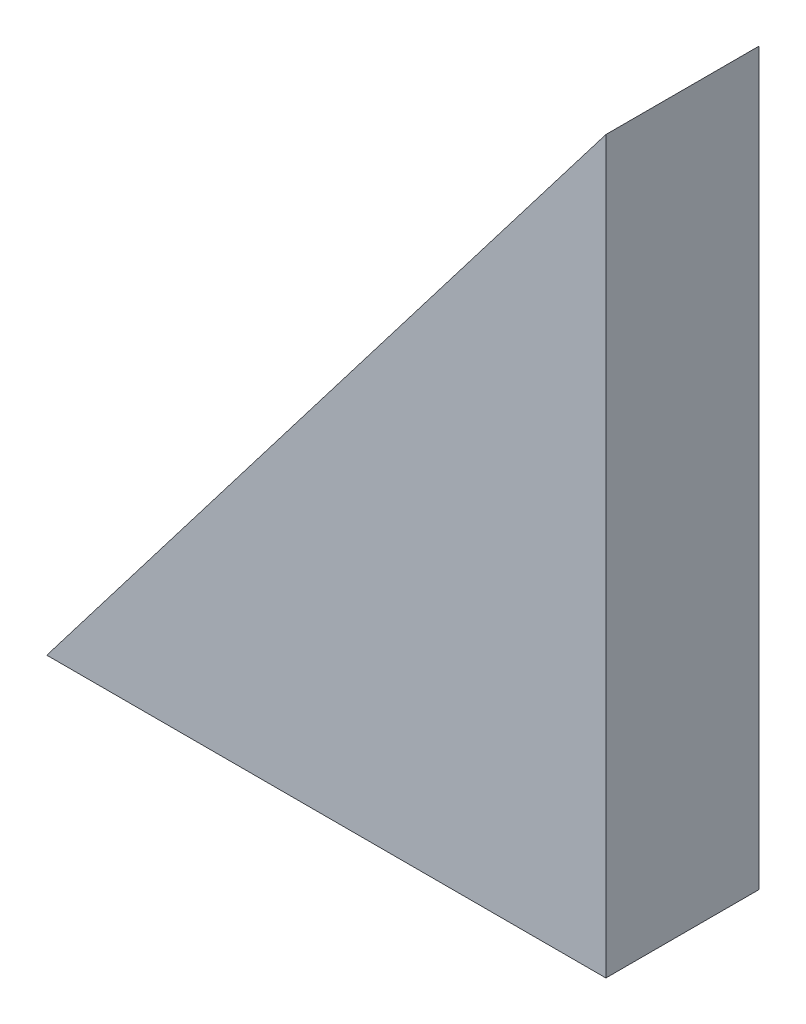
ISO-10303-21;
HEADER;
FILE_DESCRIPTION(('STEP AP214'),'2;1');
FILE_NAME('part.step','',(''),(''),'','','');
FILE_SCHEMA(('AUTOMOTIVE_DESIGN { 1 0 10303 214 1 1 1 1 }'));
ENDSEC;
DATA;
#1=APPLICATION_CONTEXT('core data for automotive mechanical design processes');
#2=APPLICATION_PROTOCOL_DEFINITION('international standard','automotive_design',2000,#1);
#3=PRODUCT_CONTEXT('',#1,'mechanical');
#4=PRODUCT('Part','Part','',(#3));
#5=PRODUCT_RELATED_PRODUCT_CATEGORY('part','',(#4));
#6=PRODUCT_DEFINITION_FORMATION('','',#4);
#7=PRODUCT_DEFINITION_CONTEXT('part definition',#1,'design');
#8=PRODUCT_DEFINITION('design','',#6,#7);
#9=PRODUCT_DEFINITION_SHAPE('','',#8);
#10=(LENGTH_UNIT() NAMED_UNIT(*) SI_UNIT(.MILLI.,.METRE.));
#11=(NAMED_UNIT(*) PLANE_ANGLE_UNIT() SI_UNIT($,.RADIAN.));
#12=(NAMED_UNIT(*) SI_UNIT($,.STERADIAN.) SOLID_ANGLE_UNIT());
#13=UNCERTAINTY_MEASURE_WITH_UNIT(LENGTH_MEASURE(1.E-05),#10,'distance_accuracy_value','');
#14=(GEOMETRIC_REPRESENTATION_CONTEXT(3) GLOBAL_UNCERTAINTY_ASSIGNED_CONTEXT((#13)) GLOBAL_UNIT_ASSIGNED_CONTEXT((#10,
#11,#12)) REPRESENTATION_CONTEXT('',''));
#15=CARTESIAN_POINT('',(0.,0.,0.));
#16=DIRECTION('',(0.,0.,1.));
#17=DIRECTION('',(1.,0.,0.));
#18=AXIS2_PLACEMENT_3D('',#15,#16,#17);
#19=CARTESIAN_POINT('',(-46.4148094009228,60.5101525690421,12.7));
#20=DIRECTION('',(0.794096490407238,-0.607791710969233,0.));
#21=DIRECTION('',(0.607791710969233,0.794096490407238,0.));
#22=AXIS2_PLACEMENT_3D('',#19,#20,#21);
#23=PLANE('',#22);
#24=DIRECTION('',(-0.607791710969233,-0.794096490407238,0.));
#25=VECTOR('',#24,1.);
#26=CARTESIAN_POINT('',(-46.4148094009228,60.5101525690421,0.));
#27=LINE('',#26,#25);
#28=CARTESIAN_POINT('',(-0.101081025067281,121.020305138074,0.));
#29=VERTEX_POINT('',#28);
#30=CARTESIAN_POINT('',(-46.4148094009228,60.5101525690421,0.));
#31=VERTEX_POINT('',#30);
#32=EDGE_CURVE('E78',#29,#31,#27,.T.);
#33=ORIENTED_EDGE('',*,*,#32,.T.);
#34=DIRECTION('',(0.,0.,-1.));
#35=VECTOR('',#34,1.);
#36=CARTESIAN_POINT('',(-46.4148094009228,60.5101525690421,12.7));
#37=LINE('',#36,#35);
#38=CARTESIAN_POINT('',(-46.4148094009228,60.5101525690421,12.7));
#39=VERTEX_POINT('',#38);
#40=EDGE_CURVE('E11',#39,#31,#37,.T.);
#41=ORIENTED_EDGE('',*,*,#40,.F.);
#42=DIRECTION('',(-0.607791710969233,-0.794096490407238,0.));
#43=VECTOR('',#42,1.);
#44=CARTESIAN_POINT('',(-46.4148094009228,60.5101525690421,12.7));
#45=LINE('',#44,#43);
#46=CARTESIAN_POINT('',(-0.101081025067281,121.020305138074,12.7));
#47=VERTEX_POINT('',#46);
#48=EDGE_CURVE('E71',#47,#39,#45,.T.);
#49=ORIENTED_EDGE('',*,*,#48,.F.);
#50=DIRECTION('',(0.,0.,-1.));
#51=VECTOR('',#50,1.);
#52=CARTESIAN_POINT('',(-0.101081025067281,121.020305138074,12.7));
#53=LINE('',#52,#51);
#54=EDGE_CURVE('E79',#47,#29,#53,.T.);
#55=ORIENTED_EDGE('',*,*,#54,.T.);
#56=EDGE_LOOP('',(#33,#41,#49,#55));
#57=FACE_BOUND('',#56,.T.);
#58=ADVANCED_FACE('F31',(#57),#23,.F.);
#59=CARTESIAN_POINT('',(-0.101081025066035,60.5101525690396,12.7));
#60=DIRECTION('',(0.,1.,0.));
#61=DIRECTION('',(-1.,0.,0.));
#62=AXIS2_PLACEMENT_3D('',#59,#60,#61);
#63=PLANE('',#62);
#64=DIRECTION('',(1.,0.,0.));
#65=VECTOR('',#64,1.);
#66=CARTESIAN_POINT('',(-0.101081025066035,60.5101525690396,0.));
#67=LINE('',#66,#65);
#68=CARTESIAN_POINT('',(-0.101081025066035,60.5101525690396,0.));
#69=VERTEX_POINT('',#68);
#70=EDGE_CURVE('E59',#31,#69,#67,.T.);
#71=ORIENTED_EDGE('',*,*,#70,.T.);
#72=DIRECTION('',(0.,0.,-1.));
#73=VECTOR('',#72,1.);
#74=CARTESIAN_POINT('',(-0.101081025066035,60.5101525690396,12.7));
#75=LINE('',#74,#73);
#76=CARTESIAN_POINT('',(-0.101081025066035,60.5101525690396,12.7));
#77=VERTEX_POINT('',#76);
#78=EDGE_CURVE('E39',#77,#69,#75,.T.);
#79=ORIENTED_EDGE('',*,*,#78,.F.);
#80=DIRECTION('',(1.,0.,0.));
#81=VECTOR('',#80,1.);
#82=CARTESIAN_POINT('',(-0.101081025066035,60.5101525690396,12.7));
#83=LINE('',#82,#81);
#84=EDGE_CURVE('E67',#39,#77,#83,.T.);
#85=ORIENTED_EDGE('',*,*,#84,.F.);
#86=ORIENTED_EDGE('',*,*,#40,.T.);
#87=EDGE_LOOP('',(#71,#79,#85,#86));
#88=FACE_BOUND('',#87,.T.);
#89=ADVANCED_FACE('F68',(#88),#63,.F.);
#90=CARTESIAN_POINT('',(-0.101081025067281,121.020305138074,12.7));
#91=DIRECTION('',(-1.,0.,0.));
#92=DIRECTION('',(0.,-1.,0.));
#93=AXIS2_PLACEMENT_3D('',#90,#91,#92);
#94=PLANE('',#93);
#95=DIRECTION('',(0.,1.,0.));
#96=VECTOR('',#95,1.);
#97=CARTESIAN_POINT('',(-0.101081025067281,121.020305138074,0.));
#98=LINE('',#97,#96);
#99=EDGE_CURVE('E64',#69,#29,#98,.T.);
#100=ORIENTED_EDGE('',*,*,#99,.T.);
#101=ORIENTED_EDGE('',*,*,#54,.F.);
#102=DIRECTION('',(0.,1.,0.));
#103=VECTOR('',#102,1.);
#104=CARTESIAN_POINT('',(-0.101081025067281,121.020305138074,12.7));
#105=LINE('',#104,#103);
#106=EDGE_CURVE('E47',#77,#47,#105,.T.);
#107=ORIENTED_EDGE('',*,*,#106,.F.);
#108=ORIENTED_EDGE('',*,*,#78,.T.);
#109=EDGE_LOOP('',(#100,#101,#107,#108));
#110=FACE_BOUND('',#109,.T.);
#111=ADVANCED_FACE('F86',(#110),#94,.F.);
#112=CARTESIAN_POINT('',(-46.4148094009228,60.5101525690421,12.7));
#113=DIRECTION('',(0.,0.,1.));
#114=DIRECTION('',(1.,0.,0.));
#115=AXIS2_PLACEMENT_3D('',#112,#113,#114);
#116=PLANE('',#115);
#117=ORIENTED_EDGE('',*,*,#48,.T.);
#118=ORIENTED_EDGE('',*,*,#84,.T.);
#119=ORIENTED_EDGE('',*,*,#106,.T.);
#120=EDGE_LOOP('',(#117,#118,#119));
#121=FACE_BOUND('',#120,.T.);
#122=ADVANCED_FACE('F74',(#121),#116,.T.);
#123=CARTESIAN_POINT('',(-46.4148094009228,60.5101525690421,0.));
#124=DIRECTION('',(0.,0.,1.));
#125=DIRECTION('',(1.,0.,0.));
#126=AXIS2_PLACEMENT_3D('',#123,#124,#125);
#127=PLANE('',#126);
#128=ORIENTED_EDGE('',*,*,#32,.F.);
#129=ORIENTED_EDGE('',*,*,#99,.F.);
#130=ORIENTED_EDGE('',*,*,#70,.F.);
#131=EDGE_LOOP('',(#128,#129,#130));
#132=FACE_BOUND('',#131,.T.);
#133=ADVANCED_FACE('F87',(#132),#127,.F.);
#134=CLOSED_SHELL('',(#58,#89,#111,#122,#133));
#135=MANIFOLD_SOLID_BREP('B2',#134);
#136=ADVANCED_BREP_SHAPE_REPRESENTATION('',(#18,#135),#14);
#137=SHAPE_DEFINITION_REPRESENTATION(#9,#136);
ENDSEC;
END-ISO-10303-21;
